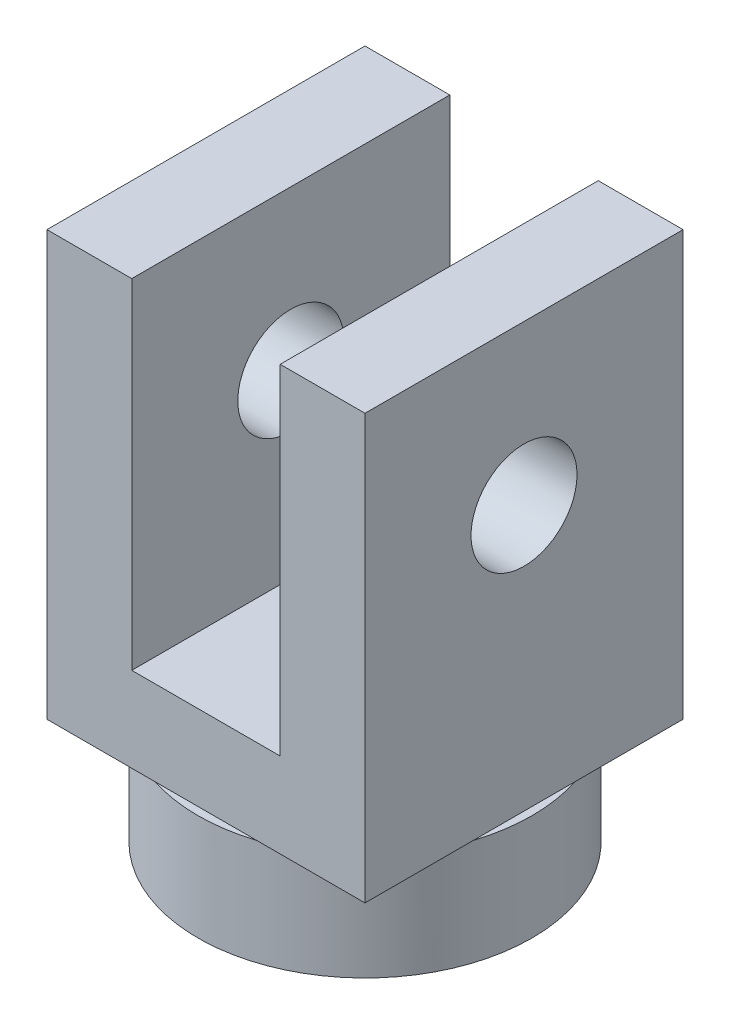
ISO-10303-21;
HEADER;
FILE_DESCRIPTION(('STEP AP214'),'2;1');
FILE_NAME('part.step','',(''),(''),'','','');
FILE_SCHEMA(('AUTOMOTIVE_DESIGN { 1 0 10303 214 1 1 1 1 }'));
ENDSEC;
DATA;
#1=APPLICATION_CONTEXT('core data for automotive mechanical design processes');
#2=APPLICATION_PROTOCOL_DEFINITION('international standard','automotive_design',2000,#1);
#3=PRODUCT_CONTEXT('',#1,'mechanical');
#4=PRODUCT('Part','Part','',(#3));
#5=PRODUCT_RELATED_PRODUCT_CATEGORY('part','',(#4));
#6=PRODUCT_DEFINITION_FORMATION('','',#4);
#7=PRODUCT_DEFINITION_CONTEXT('part definition',#1,'design');
#8=PRODUCT_DEFINITION('design','',#6,#7);
#9=PRODUCT_DEFINITION_SHAPE('','',#8);
#10=(LENGTH_UNIT() NAMED_UNIT(*) SI_UNIT(.MILLI.,.METRE.));
#11=(NAMED_UNIT(*) PLANE_ANGLE_UNIT() SI_UNIT($,.RADIAN.));
#12=(NAMED_UNIT(*) SI_UNIT($,.STERADIAN.) SOLID_ANGLE_UNIT());
#13=UNCERTAINTY_MEASURE_WITH_UNIT(LENGTH_MEASURE(1.E-05),#10,'distance_accuracy_value','');
#14=(GEOMETRIC_REPRESENTATION_CONTEXT(3) GLOBAL_UNCERTAINTY_ASSIGNED_CONTEXT((#13)) GLOBAL_UNIT_ASSIGNED_CONTEXT((#10,
#11,#12)) REPRESENTATION_CONTEXT('',''));
#15=CARTESIAN_POINT('',(0.,0.,0.));
#16=DIRECTION('',(0.,0.,1.));
#17=DIRECTION('',(1.,0.,0.));
#18=AXIS2_PLACEMENT_3D('',#15,#16,#17);
#19=CARTESIAN_POINT('',(-9.525,-12.7,9.525));
#20=DIRECTION('',(0.,1.,0.));
#21=DIRECTION('',(-1.,0.,0.));
#22=AXIS2_PLACEMENT_3D('',#19,#20,#21);
#23=PLANE('',#22);
#24=CARTESIAN_POINT('',(0.,-12.7,0.));
#25=DIRECTION('',(0.,-1.,0.));
#26=DIRECTION('',(1.,0.,0.));
#27=AXIS2_PLACEMENT_3D('',#24,#25,#26);
#28=CIRCLE('',#27,10.);
#29=CARTESIAN_POINT('',(9.525,-12.7,3.04538585404216));
#30=VERTEX_POINT('',#29);
#31=CARTESIAN_POINT('',(3.04538585404215,-12.7,9.525));
#32=VERTEX_POINT('',#31);
#33=EDGE_CURVE('E154',#30,#32,#28,.T.);
#34=ORIENTED_EDGE('',*,*,#33,.F.);
#35=DIRECTION('',(0.,0.,-1.));
#36=VECTOR('',#35,1.);
#37=CARTESIAN_POINT('',(9.525,-12.7,9.525));
#38=LINE('',#37,#36);
#39=CARTESIAN_POINT('',(9.525,-12.7,9.525));
#40=VERTEX_POINT('',#39);
#41=EDGE_CURVE('E135',#40,#30,#38,.T.);
#42=ORIENTED_EDGE('',*,*,#41,.F.);
#43=DIRECTION('',(1.,0.,0.));
#44=VECTOR('',#43,1.);
#45=CARTESIAN_POINT('',(-9.525,-12.7,9.525));
#46=LINE('',#45,#44);
#47=EDGE_CURVE('E223',#32,#40,#46,.T.);
#48=ORIENTED_EDGE('',*,*,#47,.F.);
#49=EDGE_LOOP('',(#34,#42,#48));
#50=FACE_BOUND('',#49,.T.);
#51=ADVANCED_FACE('F35',(#50),#23,.F.);
#52=CARTESIAN_POINT('',(-3.04538585404214,-12.7,9.525));
#53=VERTEX_POINT('',#52);
#54=CARTESIAN_POINT('',(-9.525,-12.7,3.04538585404213));
#55=VERTEX_POINT('',#54);
#56=EDGE_CURVE('E11',#53,#55,#28,.T.);
#57=ORIENTED_EDGE('',*,*,#56,.F.);
#58=CARTESIAN_POINT('',(-9.525,-12.7,9.525));
#59=VERTEX_POINT('',#58);
#60=EDGE_CURVE('E219',#59,#53,#46,.T.);
#61=ORIENTED_EDGE('',*,*,#60,.F.);
#62=DIRECTION('',(0.,0.,-1.));
#63=VECTOR('',#62,1.);
#64=CARTESIAN_POINT('',(-9.525,-12.7,9.525));
#65=LINE('',#64,#63);
#66=EDGE_CURVE('E160',#59,#55,#65,.T.);
#67=ORIENTED_EDGE('',*,*,#66,.T.);
#68=EDGE_LOOP('',(#57,#61,#67));
#69=FACE_BOUND('',#68,.T.);
#70=ADVANCED_FACE('F238',(#69),#23,.F.);
#71=CARTESIAN_POINT('',(-9.525,-12.7,-3.04538585404213));
#72=VERTEX_POINT('',#71);
#73=CARTESIAN_POINT('',(-3.04538585404214,-12.7,-9.525));
#74=VERTEX_POINT('',#73);
#75=EDGE_CURVE('E44',#72,#74,#28,.T.);
#76=ORIENTED_EDGE('',*,*,#75,.F.);
#77=CARTESIAN_POINT('',(-9.525,-12.7,-9.525));
#78=VERTEX_POINT('',#77);
#79=EDGE_CURVE('E173',#72,#78,#65,.T.);
#80=ORIENTED_EDGE('',*,*,#79,.T.);
#81=DIRECTION('',(1.,0.,0.));
#82=VECTOR('',#81,1.);
#83=CARTESIAN_POINT('',(-9.525,-12.7,-9.525));
#84=LINE('',#83,#82);
#85=EDGE_CURVE('E202',#78,#74,#84,.T.);
#86=ORIENTED_EDGE('',*,*,#85,.T.);
#87=EDGE_LOOP('',(#76,#80,#86));
#88=FACE_BOUND('',#87,.T.);
#89=ADVANCED_FACE('F266',(#88),#23,.F.);
#90=CARTESIAN_POINT('',(-9.525,12.7,9.525));
#91=DIRECTION('',(0.,-1.,0.));
#92=DIRECTION('',(0.,0.,-1.));
#93=AXIS2_PLACEMENT_3D('',#90,#91,#92);
#94=PLANE('',#93);
#95=DIRECTION('',(-1.,0.,0.));
#96=VECTOR('',#95,1.);
#97=CARTESIAN_POINT('',(-9.525,12.7,-9.525));
#98=LINE('',#97,#96);
#99=CARTESIAN_POINT('',(-4.445,12.7,-9.525));
#100=VERTEX_POINT('',#99);
#101=CARTESIAN_POINT('',(-9.525,12.7,-9.525));
#102=VERTEX_POINT('',#101);
#103=EDGE_CURVE('E166',#100,#102,#98,.T.);
#104=ORIENTED_EDGE('',*,*,#103,.T.);
#105=DIRECTION('',(0.,0.,-1.));
#106=VECTOR('',#105,1.);
#107=CARTESIAN_POINT('',(-9.525,12.7,9.525));
#108=LINE('',#107,#106);
#109=CARTESIAN_POINT('',(-9.525,12.7,9.525));
#110=VERTEX_POINT('',#109);
#111=EDGE_CURVE('E158',#110,#102,#108,.T.);
#112=ORIENTED_EDGE('',*,*,#111,.F.);
#113=DIRECTION('',(-1.,0.,0.));
#114=VECTOR('',#113,1.);
#115=CARTESIAN_POINT('',(-9.525,12.7,9.525));
#116=LINE('',#115,#114);
#117=CARTESIAN_POINT('',(-4.445,12.7,9.525));
#118=VERTEX_POINT('',#117);
#119=EDGE_CURVE('E193',#118,#110,#116,.T.);
#120=ORIENTED_EDGE('',*,*,#119,.F.);
#121=DIRECTION('',(0.,0.,-1.));
#122=VECTOR('',#121,1.);
#123=CARTESIAN_POINT('',(-4.445,12.7,9.525));
#124=LINE('',#123,#122);
#125=EDGE_CURVE('E187',#118,#100,#124,.T.);
#126=ORIENTED_EDGE('',*,*,#125,.T.);
#127=EDGE_LOOP('',(#104,#112,#120,#126));
#128=FACE_BOUND('',#127,.T.);
#129=ADVANCED_FACE('F37',(#128),#94,.F.);
#130=CARTESIAN_POINT('',(-9.525,12.7,9.525));
#131=DIRECTION('',(1.,0.,0.));
#132=DIRECTION('',(0.,1.,0.));
#133=AXIS2_PLACEMENT_3D('',#130,#131,#132);
#134=PLANE('',#133);
#135=CARTESIAN_POINT('',(-9.525,3.17499999999999,0.));
#136=DIRECTION('',(1.,0.,0.));
#137=DIRECTION('',(0.,1.,0.));
#138=AXIS2_PLACEMENT_3D('',#135,#136,#137);
#139=CIRCLE('',#138,3.175);
#140=CARTESIAN_POINT('',(-9.52500000000001,3.17499999999999,-3.175));
#141=VERTEX_POINT('',#140);
#142=EDGE_CURVE('E380',#141,#141,#139,.T.);
#143=ORIENTED_EDGE('',*,*,#142,.T.);
#144=EDGE_LOOP('',(#143));
#145=FACE_BOUND('',#144,.T.);
#146=DIRECTION('',(0.,-1.,0.));
#147=VECTOR('',#146,1.);
#148=CARTESIAN_POINT('',(-9.525,12.7,-9.525));
#149=LINE('',#148,#147);
#150=EDGE_CURVE('E205',#102,#78,#149,.T.);
#151=ORIENTED_EDGE('',*,*,#150,.T.);
#152=ORIENTED_EDGE('',*,*,#79,.F.);
#153=EDGE_CURVE('E59',#55,#72,#65,.T.);
#154=ORIENTED_EDGE('',*,*,#153,.F.);
#155=ORIENTED_EDGE('',*,*,#66,.F.);
#156=DIRECTION('',(0.,-1.,0.));
#157=VECTOR('',#156,1.);
#158=CARTESIAN_POINT('',(-9.525,12.7,9.525));
#159=LINE('',#158,#157);
#160=EDGE_CURVE('E224',#110,#59,#159,.T.);
#161=ORIENTED_EDGE('',*,*,#160,.F.);
#162=ORIENTED_EDGE('',*,*,#111,.T.);
#163=EDGE_LOOP('',(#151,#152,#154,#155,#161,#162));
#164=FACE_BOUND('',#163,.T.);
#165=ADVANCED_FACE('F234',(#145,#164),#134,.F.);
#166=CARTESIAN_POINT('',(3.04538585404215,-12.7,-9.525));
#167=VERTEX_POINT('',#166);
#168=CARTESIAN_POINT('',(9.525,-12.7,-3.04538585404216));
#169=VERTEX_POINT('',#168);
#170=EDGE_CURVE('E143',#167,#169,#28,.T.);
#171=ORIENTED_EDGE('',*,*,#170,.F.);
#172=CARTESIAN_POINT('',(9.525,-12.7,-9.525));
#173=VERTEX_POINT('',#172);
#174=EDGE_CURVE('E145',#167,#173,#84,.T.);
#175=ORIENTED_EDGE('',*,*,#174,.T.);
#176=EDGE_CURVE('E131',#169,#173,#38,.T.);
#177=ORIENTED_EDGE('',*,*,#176,.F.);
#178=EDGE_LOOP('',(#171,#175,#177));
#179=FACE_BOUND('',#178,.T.);
#180=ADVANCED_FACE('F141',(#179),#23,.F.);
#181=CARTESIAN_POINT('',(9.525,-12.7,9.525));
#182=DIRECTION('',(-1.,0.,0.));
#183=DIRECTION('',(0.,-1.,0.));
#184=AXIS2_PLACEMENT_3D('',#181,#182,#183);
#185=PLANE('',#184);
#186=CARTESIAN_POINT('',(9.525,3.17499999999999,0.));
#187=DIRECTION('',(1.,0.,0.));
#188=DIRECTION('',(0.,0.,-1.));
#189=AXIS2_PLACEMENT_3D('',#186,#187,#188);
#190=CIRCLE('',#189,3.175);
#191=CARTESIAN_POINT('',(9.525,3.17499999999999,-3.175));
#192=VERTEX_POINT('',#191);
#193=EDGE_CURVE('E390',#192,#192,#190,.T.);
#194=ORIENTED_EDGE('',*,*,#193,.F.);
#195=EDGE_LOOP('',(#194));
#196=FACE_BOUND('',#195,.T.);
#197=DIRECTION('',(0.,1.,0.));
#198=VECTOR('',#197,1.);
#199=CARTESIAN_POINT('',(9.525,-12.7,-9.525));
#200=LINE('',#199,#198);
#201=CARTESIAN_POINT('',(9.52500000000001,12.7,-9.525));
#202=VERTEX_POINT('',#201);
#203=EDGE_CURVE('E200',#173,#202,#200,.T.);
#204=ORIENTED_EDGE('',*,*,#203,.T.);
#205=DIRECTION('',(0.,0.,-1.));
#206=VECTOR('',#205,1.);
#207=CARTESIAN_POINT('',(9.52500000000001,12.7,9.525));
#208=LINE('',#207,#206);
#209=CARTESIAN_POINT('',(9.52500000000001,12.7,9.525));
#210=VERTEX_POINT('',#209);
#211=EDGE_CURVE('E147',#210,#202,#208,.T.);
#212=ORIENTED_EDGE('',*,*,#211,.F.);
#213=DIRECTION('',(0.,1.,0.));
#214=VECTOR('',#213,1.);
#215=CARTESIAN_POINT('',(9.525,-12.7,9.525));
#216=LINE('',#215,#214);
#217=EDGE_CURVE('E217',#40,#210,#216,.T.);
#218=ORIENTED_EDGE('',*,*,#217,.F.);
#219=ORIENTED_EDGE('',*,*,#41,.T.);
#220=EDGE_CURVE('E128',#30,#169,#38,.T.);
#221=ORIENTED_EDGE('',*,*,#220,.T.);
#222=ORIENTED_EDGE('',*,*,#176,.T.);
#223=EDGE_LOOP('',(#204,#212,#218,#219,#221,#222));
#224=FACE_BOUND('',#223,.T.);
#225=ADVANCED_FACE('F130',(#196,#224),#185,.F.);
#226=CARTESIAN_POINT('',(4.445,12.7,9.525));
#227=DIRECTION('',(0.,-1.,0.));
#228=DIRECTION('',(1.,0.,0.));
#229=AXIS2_PLACEMENT_3D('',#226,#227,#228);
#230=PLANE('',#229);
#231=DIRECTION('',(-1.,0.,0.));
#232=VECTOR('',#231,1.);
#233=CARTESIAN_POINT('',(4.445,12.7,-9.525));
#234=LINE('',#233,#232);
#235=CARTESIAN_POINT('',(4.445,12.7,-9.525));
#236=VERTEX_POINT('',#235);
#237=EDGE_CURVE('E198',#202,#236,#234,.T.);
#238=ORIENTED_EDGE('',*,*,#237,.T.);
#239=DIRECTION('',(0.,0.,-1.));
#240=VECTOR('',#239,1.);
#241=CARTESIAN_POINT('',(4.445,12.7,9.525));
#242=LINE('',#241,#240);
#243=CARTESIAN_POINT('',(4.445,12.7,9.525));
#244=VERTEX_POINT('',#243);
#245=EDGE_CURVE('E178',#244,#236,#242,.T.);
#246=ORIENTED_EDGE('',*,*,#245,.F.);
#247=DIRECTION('',(-1.,0.,0.));
#248=VECTOR('',#247,1.);
#249=CARTESIAN_POINT('',(4.445,12.7,9.525));
#250=LINE('',#249,#248);
#251=EDGE_CURVE('E215',#210,#244,#250,.T.);
#252=ORIENTED_EDGE('',*,*,#251,.F.);
#253=ORIENTED_EDGE('',*,*,#211,.T.);
#254=EDGE_LOOP('',(#238,#246,#252,#253));
#255=FACE_BOUND('',#254,.T.);
#256=ADVANCED_FACE('F249',(#255),#230,.F.);
#257=CARTESIAN_POINT('',(4.445,-7.62000000000001,9.525));
#258=DIRECTION('',(1.,0.,0.));
#259=DIRECTION('',(0.,1.,0.));
#260=AXIS2_PLACEMENT_3D('',#257,#258,#259);
#261=PLANE('',#260);
#262=CARTESIAN_POINT('',(4.445,3.17499999999999,0.));
#263=DIRECTION('',(1.,0.,0.));
#264=DIRECTION('',(0.,1.,0.));
#265=AXIS2_PLACEMENT_3D('',#262,#263,#264);
#266=CIRCLE('',#265,3.175);
#267=CARTESIAN_POINT('',(4.445,6.34999999999999,0.));
#268=VERTEX_POINT('',#267);
#269=EDGE_CURVE('E385',#268,#268,#266,.T.);
#270=ORIENTED_EDGE('',*,*,#269,.T.);
#271=EDGE_LOOP('',(#270));
#272=FACE_BOUND('',#271,.T.);
#273=DIRECTION('',(0.,-1.,0.));
#274=VECTOR('',#273,1.);
#275=CARTESIAN_POINT('',(4.445,-7.62000000000001,-9.525));
#276=LINE('',#275,#274);
#277=CARTESIAN_POINT('',(4.445,-7.62000000000001,-9.525));
#278=VERTEX_POINT('',#277);
#279=EDGE_CURVE('E196',#236,#278,#276,.T.);
#280=ORIENTED_EDGE('',*,*,#279,.T.);
#281=DIRECTION('',(0.,0.,-1.));
#282=VECTOR('',#281,1.);
#283=CARTESIAN_POINT('',(4.445,-7.62000000000001,9.525));
#284=LINE('',#283,#282);
#285=CARTESIAN_POINT('',(4.445,-7.62000000000001,9.525));
#286=VERTEX_POINT('',#285);
#287=EDGE_CURVE('E181',#286,#278,#284,.T.);
#288=ORIENTED_EDGE('',*,*,#287,.F.);
#289=DIRECTION('',(0.,-1.,0.));
#290=VECTOR('',#289,1.);
#291=CARTESIAN_POINT('',(4.445,-7.62000000000001,9.525));
#292=LINE('',#291,#290);
#293=EDGE_CURVE('E213',#244,#286,#292,.T.);
#294=ORIENTED_EDGE('',*,*,#293,.F.);
#295=ORIENTED_EDGE('',*,*,#245,.T.);
#296=EDGE_LOOP('',(#280,#288,#294,#295));
#297=FACE_BOUND('',#296,.T.);
#298=ADVANCED_FACE('F255',(#272,#297),#261,.F.);
#299=CARTESIAN_POINT('',(-4.445,-7.62000000000001,9.525));
#300=DIRECTION('',(0.,-1.,0.));
#301=DIRECTION('',(0.,0.,-1.));
#302=AXIS2_PLACEMENT_3D('',#299,#300,#301);
#303=PLANE('',#302);
#304=CARTESIAN_POINT('',(0.,-7.62000000000001,0.));
#305=DIRECTION('',(0.,-1.,0.));
#306=DIRECTION('',(0.,0.,-1.));
#307=AXIS2_PLACEMENT_3D('',#304,#305,#306);
#308=CIRCLE('',#307,3.175);
#309=CARTESIAN_POINT('',(0.,-7.62000000000001,-3.175));
#310=VERTEX_POINT('',#309);
#311=EDGE_CURVE('E153',#310,#310,#308,.F.);
#312=ORIENTED_EDGE('',*,*,#311,.F.);
#313=EDGE_LOOP('',(#312));
#314=FACE_BOUND('',#313,.T.);
#315=DIRECTION('',(-1.,0.,0.));
#316=VECTOR('',#315,1.);
#317=CARTESIAN_POINT('',(-4.445,-7.62000000000001,-9.525));
#318=LINE('',#317,#316);
#319=CARTESIAN_POINT('',(-4.445,-7.62000000000001,-9.525));
#320=VERTEX_POINT('',#319);
#321=EDGE_CURVE('E194',#278,#320,#318,.T.);
#322=ORIENTED_EDGE('',*,*,#321,.T.);
#323=DIRECTION('',(0.,0.,-1.));
#324=VECTOR('',#323,1.);
#325=CARTESIAN_POINT('',(-4.445,-7.62000000000001,9.525));
#326=LINE('',#325,#324);
#327=CARTESIAN_POINT('',(-4.445,-7.62000000000001,9.525));
#328=VERTEX_POINT('',#327);
#329=EDGE_CURVE('E184',#328,#320,#326,.T.);
#330=ORIENTED_EDGE('',*,*,#329,.F.);
#331=DIRECTION('',(-1.,0.,0.));
#332=VECTOR('',#331,1.);
#333=CARTESIAN_POINT('',(-4.445,-7.62000000000001,9.525));
#334=LINE('',#333,#332);
#335=EDGE_CURVE('E211',#286,#328,#334,.T.);
#336=ORIENTED_EDGE('',*,*,#335,.F.);
#337=ORIENTED_EDGE('',*,*,#287,.T.);
#338=EDGE_LOOP('',(#322,#330,#336,#337));
#339=FACE_BOUND('',#338,.T.);
#340=ADVANCED_FACE('F259',(#314,#339),#303,.F.);
#341=CARTESIAN_POINT('',(-4.445,12.7,9.525));
#342=DIRECTION('',(-1.,0.,0.));
#343=DIRECTION('',(0.,-1.,0.));
#344=AXIS2_PLACEMENT_3D('',#341,#342,#343);
#345=PLANE('',#344);
#346=CARTESIAN_POINT('',(-4.445,3.17499999999999,0.));
#347=DIRECTION('',(-1.,0.,0.));
#348=DIRECTION('',(0.,-1.,0.));
#349=AXIS2_PLACEMENT_3D('',#346,#347,#348);
#350=CIRCLE('',#349,3.175);
#351=CARTESIAN_POINT('',(-4.445,3.17499999999999,-3.175));
#352=VERTEX_POINT('',#351);
#353=EDGE_CURVE('E39',#352,#352,#350,.T.);
#354=ORIENTED_EDGE('',*,*,#353,.T.);
#355=EDGE_LOOP('',(#354));
#356=FACE_BOUND('',#355,.T.);
#357=DIRECTION('',(0.,1.,0.));
#358=VECTOR('',#357,1.);
#359=CARTESIAN_POINT('',(-4.445,12.7,-9.525));
#360=LINE('',#359,#358);
#361=EDGE_CURVE('E191',#320,#100,#360,.T.);
#362=ORIENTED_EDGE('',*,*,#361,.T.);
#363=ORIENTED_EDGE('',*,*,#125,.F.);
#364=DIRECTION('',(0.,1.,0.));
#365=VECTOR('',#364,1.);
#366=CARTESIAN_POINT('',(-4.445,12.7,9.525));
#367=LINE('',#366,#365);
#368=EDGE_CURVE('E190',#328,#118,#367,.T.);
#369=ORIENTED_EDGE('',*,*,#368,.F.);
#370=ORIENTED_EDGE('',*,*,#329,.T.);
#371=EDGE_LOOP('',(#362,#363,#369,#370));
#372=FACE_BOUND('',#371,.T.);
#373=ADVANCED_FACE('F262',(#356,#372),#345,.F.);
#374=CARTESIAN_POINT('',(0.,0.,9.525));
#375=DIRECTION('',(0.,0.,-1.));
#376=DIRECTION('',(-1.,0.,0.));
#377=AXIS2_PLACEMENT_3D('',#374,#375,#376);
#378=PLANE('',#377);
#379=ORIENTED_EDGE('',*,*,#119,.T.);
#380=ORIENTED_EDGE('',*,*,#160,.T.);
#381=ORIENTED_EDGE('',*,*,#60,.T.);
#382=EDGE_CURVE('E222',#53,#32,#46,.T.);
#383=ORIENTED_EDGE('',*,*,#382,.T.);
#384=ORIENTED_EDGE('',*,*,#47,.T.);
#385=ORIENTED_EDGE('',*,*,#217,.T.);
#386=ORIENTED_EDGE('',*,*,#251,.T.);
#387=ORIENTED_EDGE('',*,*,#293,.T.);
#388=ORIENTED_EDGE('',*,*,#335,.T.);
#389=ORIENTED_EDGE('',*,*,#368,.T.);
#390=EDGE_LOOP('',(#379,#380,#381,#383,#384,#385,#386,#387,#388,#389));
#391=FACE_BOUND('',#390,.T.);
#392=ADVANCED_FACE('F229',(#391),#378,.F.);
#393=CARTESIAN_POINT('',(0.,0.,-9.525));
#394=DIRECTION('',(0.,0.,-1.));
#395=DIRECTION('',(-1.,0.,0.));
#396=AXIS2_PLACEMENT_3D('',#393,#394,#395);
#397=PLANE('',#396);
#398=ORIENTED_EDGE('',*,*,#103,.F.);
#399=ORIENTED_EDGE('',*,*,#361,.F.);
#400=ORIENTED_EDGE('',*,*,#321,.F.);
#401=ORIENTED_EDGE('',*,*,#279,.F.);
#402=ORIENTED_EDGE('',*,*,#237,.F.);
#403=ORIENTED_EDGE('',*,*,#203,.F.);
#404=ORIENTED_EDGE('',*,*,#174,.F.);
#405=EDGE_CURVE('E204',#74,#167,#84,.T.);
#406=ORIENTED_EDGE('',*,*,#405,.F.);
#407=ORIENTED_EDGE('',*,*,#85,.F.);
#408=ORIENTED_EDGE('',*,*,#150,.F.);
#409=EDGE_LOOP('',(#398,#399,#400,#401,#402,#403,#404,#406,#407,#408));
#410=FACE_BOUND('',#409,.T.);
#411=ADVANCED_FACE('F264',(#410),#397,.T.);
#412=CARTESIAN_POINT('',(0.,-12.7,0.));
#413=DIRECTION('',(0.,-1.,0.));
#414=DIRECTION('',(1.,0.,0.));
#415=AXIS2_PLACEMENT_3D('',#412,#413,#414);
#416=PLANE('',#415);
#417=EDGE_CURVE('E152',#74,#167,#28,.T.);
#418=ORIENTED_EDGE('',*,*,#417,.F.);
#419=ORIENTED_EDGE('',*,*,#405,.T.);
#420=EDGE_LOOP('',(#418,#419));
#421=FACE_BOUND('',#420,.T.);
#422=ADVANCED_FACE('F268',(#421),#416,.F.);
#423=ORIENTED_EDGE('',*,*,#220,.F.);
#424=EDGE_CURVE('E148',#169,#30,#28,.T.);
#425=ORIENTED_EDGE('',*,*,#424,.F.);
#426=EDGE_LOOP('',(#423,#425));
#427=FACE_BOUND('',#426,.T.);
#428=ADVANCED_FACE('F149',(#427),#416,.F.);
#429=EDGE_CURVE('E167',#55,#72,#28,.T.);
#430=ORIENTED_EDGE('',*,*,#429,.F.);
#431=ORIENTED_EDGE('',*,*,#153,.T.);
#432=EDGE_LOOP('',(#430,#431));
#433=FACE_BOUND('',#432,.T.);
#434=ADVANCED_FACE('F172',(#433),#416,.F.);
#435=CARTESIAN_POINT('',(0.,-19.05,0.));
#436=DIRECTION('',(0.,1.,0.));
#437=DIRECTION('',(-1.,0.,0.));
#438=AXIS2_PLACEMENT_3D('',#435,#436,#437);
#439=CYLINDRICAL_SURFACE('',#438,10.);
#440=CARTESIAN_POINT('',(0.,-19.05,0.));
#441=DIRECTION('',(0.,-1.,0.));
#442=DIRECTION('',(1.,0.,0.));
#443=AXIS2_PLACEMENT_3D('',#440,#441,#442);
#444=CIRCLE('',#443,10.);
#445=CARTESIAN_POINT('',(10.,-19.05,0.));
#446=VERTEX_POINT('',#445);
#447=EDGE_CURVE('E163',#446,#446,#444,.T.);
#448=ORIENTED_EDGE('',*,*,#447,.F.);
#449=EDGE_LOOP('',(#448));
#450=FACE_BOUND('',#449,.T.);
#451=ORIENTED_EDGE('',*,*,#33,.T.);
#452=EDGE_CURVE('E46',#32,#53,#28,.T.);
#453=ORIENTED_EDGE('',*,*,#452,.T.);
#454=ORIENTED_EDGE('',*,*,#56,.T.);
#455=ORIENTED_EDGE('',*,*,#429,.T.);
#456=ORIENTED_EDGE('',*,*,#75,.T.);
#457=ORIENTED_EDGE('',*,*,#417,.T.);
#458=ORIENTED_EDGE('',*,*,#170,.T.);
#459=ORIENTED_EDGE('',*,*,#424,.T.);
#460=EDGE_LOOP('',(#451,#453,#454,#455,#456,#457,#458,#459));
#461=FACE_BOUND('',#460,.T.);
#462=ADVANCED_FACE('F156',(#450,#461),#439,.T.);
#463=CARTESIAN_POINT('',(0.,-19.05,0.));
#464=DIRECTION('',(0.,-1.,0.));
#465=DIRECTION('',(1.,0.,0.));
#466=AXIS2_PLACEMENT_3D('',#463,#464,#465);
#467=PLANE('',#466);
#468=CARTESIAN_POINT('',(0.,-19.05,0.));
#469=DIRECTION('',(0.,-1.,0.));
#470=DIRECTION('',(1.,0.,0.));
#471=AXIS2_PLACEMENT_3D('',#468,#469,#470);
#472=CIRCLE('',#471,3.175);
#473=CARTESIAN_POINT('',(3.17499999999999,-19.05,0.));
#474=VERTEX_POINT('',#473);
#475=EDGE_CURVE('E378',#474,#474,#472,.T.);
#476=ORIENTED_EDGE('',*,*,#475,.F.);
#477=EDGE_LOOP('',(#476));
#478=FACE_BOUND('',#477,.T.);
#479=ORIENTED_EDGE('',*,*,#447,.T.);
#480=EDGE_LOOP('',(#479));
#481=FACE_BOUND('',#480,.T.);
#482=ADVANCED_FACE('F280',(#478,#481),#467,.T.);
#483=ORIENTED_EDGE('',*,*,#382,.F.);
#484=ORIENTED_EDGE('',*,*,#452,.F.);
#485=EDGE_LOOP('',(#483,#484));
#486=FACE_BOUND('',#485,.T.);
#487=ADVANCED_FACE('F242',(#486),#416,.F.);
#488=CARTESIAN_POINT('',(0.,12.701,0.));
#489=DIRECTION('',(0.,-1.,0.));
#490=DIRECTION('',(1.,0.,0.));
#491=AXIS2_PLACEMENT_3D('',#488,#489,#490);
#492=CYLINDRICAL_SURFACE('',#491,3.175);
#493=ORIENTED_EDGE('',*,*,#475,.T.);
#494=EDGE_LOOP('',(#493));
#495=FACE_BOUND('',#494,.T.);
#496=ORIENTED_EDGE('',*,*,#311,.T.);
#497=EDGE_LOOP('',(#496));
#498=FACE_BOUND('',#497,.T.);
#499=ADVANCED_FACE('F279',(#495,#498),#492,.F.);
#500=CARTESIAN_POINT('',(-10.,3.17499999999999,0.));
#501=DIRECTION('',(1.,0.,0.));
#502=DIRECTION('',(0.,0.,-1.));
#503=AXIS2_PLACEMENT_3D('',#500,#501,#502);
#504=CYLINDRICAL_SURFACE('',#503,3.175);
#505=CARTESIAN_POINT('',(-4.445,3.17499999999999,-3.175));
#506=CARTESIAN_POINT('',(-4.49791666666667,3.17499999999999,-3.175));
#507=CARTESIAN_POINT('',(-4.55083333333333,3.17499999999999,-3.175));
#508=CARTESIAN_POINT('',(-4.65666666666667,3.17499999999999,-3.175));
#509=CARTESIAN_POINT('',(-4.70958333333333,3.17499999999999,-3.175));
#510=CARTESIAN_POINT('',(-4.81541666666667,3.17499999999999,-3.175));
#511=CARTESIAN_POINT('',(-4.86833333333333,3.17499999999999,-3.175));
#512=CARTESIAN_POINT('',(-4.97416666666667,3.17499999999999,-3.175));
#513=CARTESIAN_POINT('',(-5.02708333333333,3.17499999999999,-3.175));
#514=CARTESIAN_POINT('',(-5.13291666666667,3.17499999999999,-3.175));
#515=CARTESIAN_POINT('',(-5.18583333333333,3.17499999999999,-3.175));
#516=CARTESIAN_POINT('',(-5.29166666666667,3.17499999999999,-3.175));
#517=CARTESIAN_POINT('',(-5.34458333333333,3.17499999999999,-3.175));
#518=CARTESIAN_POINT('',(-5.45041666666667,3.17499999999999,-3.175));
#519=CARTESIAN_POINT('',(-5.50333333333333,3.17499999999999,-3.175));
#520=CARTESIAN_POINT('',(-5.60916666666667,3.17499999999999,-3.175));
#521=CARTESIAN_POINT('',(-5.66208333333333,3.17499999999999,-3.175));
#522=CARTESIAN_POINT('',(-5.76791666666667,3.17499999999999,-3.175));
#523=CARTESIAN_POINT('',(-5.82083333333333,3.17499999999999,-3.175));
#524=CARTESIAN_POINT('',(-5.92666666666667,3.17499999999999,-3.175));
#525=CARTESIAN_POINT('',(-5.97958333333333,3.17499999999999,-3.175));
#526=CARTESIAN_POINT('',(-6.08541666666667,3.17499999999999,-3.175));
#527=CARTESIAN_POINT('',(-6.13833333333334,3.17499999999999,-3.175));
#528=CARTESIAN_POINT('',(-6.24416666666667,3.17499999999999,-3.175));
#529=CARTESIAN_POINT('',(-6.29708333333333,3.17499999999999,-3.175));
#530=CARTESIAN_POINT('',(-6.40291666666667,3.17499999999999,-3.175));
#531=CARTESIAN_POINT('',(-6.45583333333334,3.17499999999999,-3.175));
#532=CARTESIAN_POINT('',(-6.56166666666667,3.17499999999999,-3.175));
#533=CARTESIAN_POINT('',(-6.61458333333333,3.17499999999999,-3.175));
#534=CARTESIAN_POINT('',(-6.72041666666667,3.17499999999999,-3.175));
#535=CARTESIAN_POINT('',(-6.77333333333334,3.17499999999999,-3.175));
#536=CARTESIAN_POINT('',(-6.87916666666667,3.17499999999999,-3.175));
#537=CARTESIAN_POINT('',(-6.93208333333334,3.17499999999999,-3.175));
#538=CARTESIAN_POINT('',(-7.03791666666667,3.17499999999999,-3.175));
#539=CARTESIAN_POINT('',(-7.09083333333334,3.17499999999999,-3.175));
#540=CARTESIAN_POINT('',(-7.19666666666667,3.17499999999999,-3.175));
#541=CARTESIAN_POINT('',(-7.24958333333334,3.17499999999999,-3.175));
#542=CARTESIAN_POINT('',(-7.35541666666667,3.17499999999999,-3.175));
#543=CARTESIAN_POINT('',(-7.40833333333334,3.17499999999999,-3.175));
#544=CARTESIAN_POINT('',(-7.51416666666667,3.17499999999999,-3.175));
#545=CARTESIAN_POINT('',(-7.56708333333334,3.17499999999999,-3.175));
#546=CARTESIAN_POINT('',(-7.67291666666667,3.17499999999999,-3.175));
#547=CARTESIAN_POINT('',(-7.72583333333334,3.17499999999999,-3.175));
#548=CARTESIAN_POINT('',(-7.83166666666667,3.17499999999999,-3.175));
#549=CARTESIAN_POINT('',(-7.88458333333334,3.17499999999999,-3.175));
#550=CARTESIAN_POINT('',(-7.99041666666667,3.17499999999999,-3.175));
#551=CARTESIAN_POINT('',(-8.04333333333334,3.17499999999999,-3.175));
#552=CARTESIAN_POINT('',(-8.14916666666667,3.17499999999999,-3.175));
#553=CARTESIAN_POINT('',(-8.20208333333334,3.17499999999999,-3.175));
#554=CARTESIAN_POINT('',(-8.30791666666667,3.17499999999999,-3.175));
#555=CARTESIAN_POINT('',(-8.36083333333334,3.17499999999999,-3.175));
#556=CARTESIAN_POINT('',(-8.46666666666667,3.17499999999999,-3.175));
#557=CARTESIAN_POINT('',(-8.51958333333334,3.17499999999999,-3.175));
#558=CARTESIAN_POINT('',(-8.62541666666667,3.17499999999999,-3.175));
#559=CARTESIAN_POINT('',(-8.67833333333334,3.17499999999999,-3.175));
#560=CARTESIAN_POINT('',(-8.78416666666667,3.17499999999999,-3.175));
#561=CARTESIAN_POINT('',(-8.83708333333334,3.17499999999999,-3.175));
#562=CARTESIAN_POINT('',(-8.94291666666667,3.17499999999999,-3.175));
#563=CARTESIAN_POINT('',(-8.99583333333334,3.17499999999999,-3.175));
#564=CARTESIAN_POINT('',(-9.10166666666667,3.17499999999999,-3.175));
#565=CARTESIAN_POINT('',(-9.15458333333334,3.17499999999999,-3.175));
#566=CARTESIAN_POINT('',(-9.26041666666667,3.17499999999999,-3.175));
#567=CARTESIAN_POINT('',(-9.31333333333334,3.17499999999999,-3.175));
#568=CARTESIAN_POINT('',(-9.41916666666667,3.17499999999999,-3.175));
#569=CARTESIAN_POINT('',(-9.47208333333334,3.17499999999999,-3.175));
#570=CARTESIAN_POINT('',(-9.52500000000001,3.17499999999999,-3.175));
#571=B_SPLINE_CURVE_WITH_KNOTS('',3,(#505,#506,#507,#508,#509,#510,#511,#512,#513,#514,#515,
#516,#517,#518,#519,#520,#521,#522,#523,#524,#525,#526,#527,#528,#529,#530,#531,#532,#533,#534,
#535,#536,#537,#538,#539,#540,#541,#542,#543,#544,#545,#546,#547,#548,#549,#550,#551,#552,#553,
#554,#555,#556,#557,#558,#559,#560,#561,#562,#563,#564,#565,#566,#567,#568,#569,#570),
.UNSPECIFIED.,.F.,.F.,(4,2,2,2,2,2,2,2,2,2,2,2,2,2,2,2,2,2,2,2,2,2,2,2,2,2,2,2,2,2,2,2,4),(0.,
0.15875,0.3175,0.476250000000001,0.635000000000001,0.793750000000001,0.952500000000001,1.11125,
1.27,1.42875,1.5875,1.74625,1.905,2.06375,2.2225,2.38125,2.54,2.69875,2.8575,3.01625,3.175,
3.33375,3.4925,3.65125,3.81,3.96875000000001,4.1275,4.28625,4.445,4.60375000000001,4.7625,
4.92125000000001,5.08000000000001),.UNSPECIFIED.);
#572=EDGE_CURVE('BSEAM346',#352,#141,#571,.T.);
#573=ORIENTED_EDGE('',*,*,#353,.F.);
#574=ORIENTED_EDGE('',*,*,#142,.F.);
#575=ORIENTED_EDGE('',*,*,#572,.T.);
#576=ORIENTED_EDGE('',*,*,#572,.F.);
#577=EDGE_LOOP('',(#573,#575,#574,#576));
#578=FACE_BOUND('',#577,.T.);
#579=ADVANCED_FACE('F346',(#578),#504,.F.);
#580=ORIENTED_EDGE('',*,*,#193,.T.);
#581=EDGE_LOOP('',(#580));
#582=FACE_BOUND('',#581,.T.);
#583=ORIENTED_EDGE('',*,*,#269,.F.);
#584=EDGE_LOOP('',(#583));
#585=FACE_BOUND('',#584,.T.);
#586=ADVANCED_FACE('F351',(#582,#585),#504,.F.);
#587=CLOSED_SHELL('',(#51,#70,#89,#129,#165,#180,#225,#256,#298,#340,#373,#392,#411,#422,#428,
#434,#462,#482,#487,#499,#579,#586));
#588=MANIFOLD_SOLID_BREP('B2',#587);
#589=ADVANCED_BREP_SHAPE_REPRESENTATION('',(#18,#588),#14);
#590=SHAPE_DEFINITION_REPRESENTATION(#9,#589);
ENDSEC;
END-ISO-10303-21;
